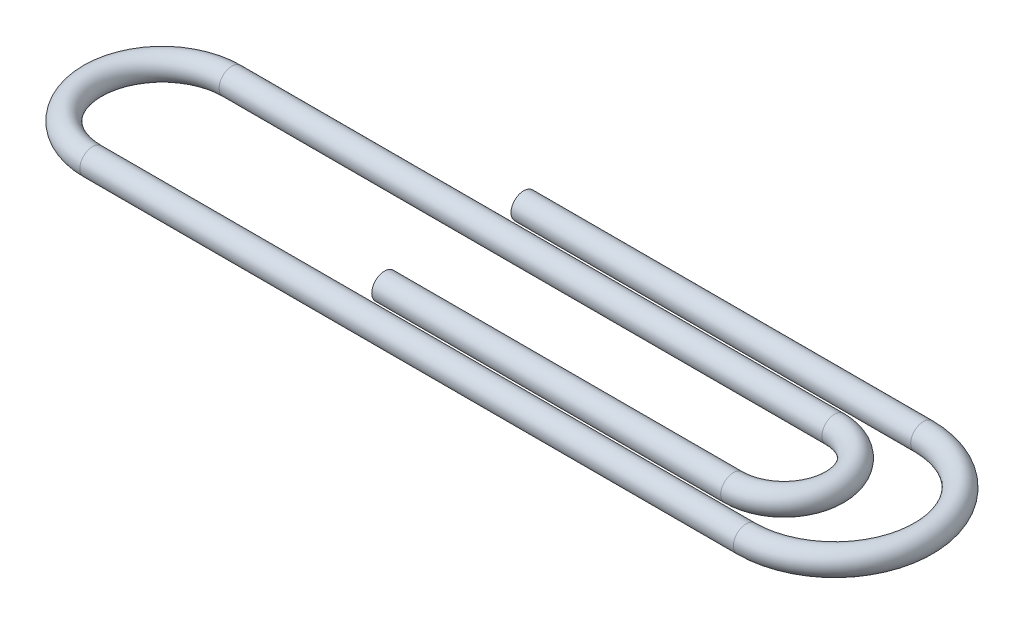
ISO-10303-21;
HEADER;
FILE_DESCRIPTION(('STEP AP214'),'2;1');
FILE_NAME('part.step','',(''),(''),'','','');
FILE_SCHEMA(('AUTOMOTIVE_DESIGN { 1 0 10303 214 1 1 1 1 }'));
ENDSEC;
DATA;
#1=APPLICATION_CONTEXT('core data for automotive mechanical design processes');
#2=APPLICATION_PROTOCOL_DEFINITION('international standard','automotive_design',2000,#1);
#3=PRODUCT_CONTEXT('',#1,'mechanical');
#4=PRODUCT('Part','Part','',(#3));
#5=PRODUCT_RELATED_PRODUCT_CATEGORY('part','',(#4));
#6=PRODUCT_DEFINITION_FORMATION('','',#4);
#7=PRODUCT_DEFINITION_CONTEXT('part definition',#1,'design');
#8=PRODUCT_DEFINITION('design','',#6,#7);
#9=PRODUCT_DEFINITION_SHAPE('','',#8);
#10=(LENGTH_UNIT() NAMED_UNIT(*) SI_UNIT(.MILLI.,.METRE.));
#11=(NAMED_UNIT(*) PLANE_ANGLE_UNIT() SI_UNIT($,.RADIAN.));
#12=(NAMED_UNIT(*) SI_UNIT($,.STERADIAN.) SOLID_ANGLE_UNIT());
#13=UNCERTAINTY_MEASURE_WITH_UNIT(LENGTH_MEASURE(1.E-05),#10,'distance_accuracy_value','');
#14=(GEOMETRIC_REPRESENTATION_CONTEXT(3) GLOBAL_UNCERTAINTY_ASSIGNED_CONTEXT((#13)) GLOBAL_UNIT_ASSIGNED_CONTEXT((#10,
#11,#12)) REPRESENTATION_CONTEXT('',''));
#15=CARTESIAN_POINT('',(0.,0.,0.));
#16=DIRECTION('',(0.,0.,1.));
#17=DIRECTION('',(1.,0.,0.));
#18=AXIS2_PLACEMENT_3D('',#15,#16,#17);
#19=CARTESIAN_POINT('',(10.,0.,-4.24338213801302));
#20=DIRECTION('',(1.,0.,0.));
#21=DIRECTION('',(0.,0.,-1.));
#22=AXIS2_PLACEMENT_3D('',#19,#20,#21);
#23=PLANE('',#22);
#24=CARTESIAN_POINT('',(10.,0.,-4.24338213801302));
#25=DIRECTION('',(1.,0.,0.));
#26=DIRECTION('',(0.,0.,-1.));
#27=AXIS2_PLACEMENT_3D('',#24,#25,#26);
#28=CIRCLE('',#27,0.5);
#29=CARTESIAN_POINT('',(10.,0.,-4.74338213801302));
#30=VERTEX_POINT('',#29);
#31=EDGE_CURVE('E76',#30,#30,#28,.T.);
#32=ORIENTED_EDGE('',*,*,#31,.F.);
#33=EDGE_LOOP('',(#32));
#34=FACE_BOUND('',#33,.T.);
#35=ADVANCED_FACE('F41',(#34),#23,.F.);
#36=CARTESIAN_POINT('',(10.,0.,1.24338213801301));
#37=DIRECTION('',(-1.,0.,0.));
#38=DIRECTION('',(0.,0.,1.));
#39=AXIS2_PLACEMENT_3D('',#36,#37,#38);
#40=PLANE('',#39);
#41=CARTESIAN_POINT('',(10.,0.,1.24338213801301));
#42=DIRECTION('',(-1.,0.,0.));
#43=DIRECTION('',(0.,0.,1.));
#44=AXIS2_PLACEMENT_3D('',#41,#42,#43);
#45=CIRCLE('',#44,0.5);
#46=CARTESIAN_POINT('',(10.,0.,1.74338213801301));
#47=VERTEX_POINT('',#46);
#48=EDGE_CURVE('E10',#47,#47,#45,.T.);
#49=ORIENTED_EDGE('',*,*,#48,.T.);
#50=EDGE_LOOP('',(#49));
#51=FACE_BOUND('',#50,.T.);
#52=ADVANCED_FACE('F84',(#51),#40,.T.);
#53=CARTESIAN_POINT('',(10.,0.,-4.24338213801302));
#54=DIRECTION('',(1.,0.,0.));
#55=DIRECTION('',(0.,0.,-1.));
#56=AXIS2_PLACEMENT_3D('',#53,#54,#55);
#57=CYLINDRICAL_SURFACE('',#56,0.5);
#58=CARTESIAN_POINT('',(25.75,0.,-4.24338213801302));
#59=DIRECTION('',(1.,0.,0.));
#60=DIRECTION('',(0.,0.,-1.));
#61=AXIS2_PLACEMENT_3D('',#58,#59,#60);
#62=CIRCLE('',#61,0.5);
#63=CARTESIAN_POINT('',(25.75,0.,-4.74338213801302));
#64=VERTEX_POINT('',#63);
#65=EDGE_CURVE('E72',#64,#64,#62,.T.);
#66=ORIENTED_EDGE('',*,*,#65,.F.);
#67=EDGE_LOOP('',(#66));
#68=FACE_BOUND('',#67,.T.);
#69=ORIENTED_EDGE('',*,*,#31,.T.);
#70=EDGE_LOOP('',(#69));
#71=FACE_BOUND('',#70,.T.);
#72=ADVANCED_FACE('F81',(#68,#71),#57,.T.);
#73=CARTESIAN_POINT('',(25.75,0.,-0.750000000000001));
#74=DIRECTION('',(0.,-1.,0.));
#75=DIRECTION('',(0.,0.,-1.));
#76=AXIS2_PLACEMENT_3D('',#73,#74,#75);
#77=TOROIDAL_SURFACE('',#76,3.49338213801302,0.5);
#78=CARTESIAN_POINT('',(25.75,0.,2.74338213801302));
#79=DIRECTION('',(-1.,0.,0.));
#80=DIRECTION('',(0.,0.,1.));
#81=AXIS2_PLACEMENT_3D('',#78,#79,#80);
#82=CIRCLE('',#81,0.5);
#83=CARTESIAN_POINT('',(25.75,0.,3.24338213801301));
#84=VERTEX_POINT('',#83);
#85=EDGE_CURVE('E68',#84,#84,#82,.T.);
#86=CARTESIAN_POINT('',(25.75,0.,-0.750000000000001));
#87=DIRECTION('',(0.,-1.,0.));
#88=DIRECTION('',(0.,0.,-1.));
#89=AXIS2_PLACEMENT_3D('',#86,#87,#88);
#90=CIRCLE('',#89,3.99338213801302);
#91=EDGE_CURVE('',#64,#84,#90,.T.);
#92=ORIENTED_EDGE('',*,*,#65,.T.);
#93=ORIENTED_EDGE('',*,*,#85,.F.);
#94=ORIENTED_EDGE('',*,*,#91,.T.);
#95=ORIENTED_EDGE('',*,*,#91,.F.);
#96=EDGE_LOOP('',(#92,#94,#93,#95));
#97=FACE_BOUND('',#96,.T.);
#98=ADVANCED_FACE('F110',(#97),#77,.T.);
#99=CARTESIAN_POINT('',(25.75,0.,2.74338213801301));
#100=DIRECTION('',(-1.,0.,0.));
#101=DIRECTION('',(0.,0.,1.));
#102=AXIS2_PLACEMENT_3D('',#99,#100,#101);
#103=CYLINDRICAL_SURFACE('',#102,0.5);
#104=CARTESIAN_POINT('',(0.,0.,2.74338213801301));
#105=DIRECTION('',(-1.,0.,0.));
#106=DIRECTION('',(0.,0.,1.));
#107=AXIS2_PLACEMENT_3D('',#104,#105,#106);
#108=CIRCLE('',#107,0.5);
#109=CARTESIAN_POINT('',(0.,0.,3.24338213801302));
#110=VERTEX_POINT('',#109);
#111=EDGE_CURVE('E64',#110,#110,#108,.T.);
#112=ORIENTED_EDGE('',*,*,#111,.F.);
#113=EDGE_LOOP('',(#112));
#114=FACE_BOUND('',#113,.T.);
#115=ORIENTED_EDGE('',*,*,#85,.T.);
#116=EDGE_LOOP('',(#115));
#117=FACE_BOUND('',#116,.T.);
#118=ADVANCED_FACE('F106',(#114,#117),#103,.T.);
#119=CARTESIAN_POINT('',(0.,0.,0.));
#120=DIRECTION('',(0.,-1.,0.));
#121=DIRECTION('',(0.,0.,-1.));
#122=AXIS2_PLACEMENT_3D('',#119,#120,#121);
#123=TOROIDAL_SURFACE('',#122,2.74338213801302,0.5);
#124=CARTESIAN_POINT('',(0.,0.,-2.74338213801301));
#125=DIRECTION('',(1.,0.,0.));
#126=DIRECTION('',(0.,0.,-1.));
#127=AXIS2_PLACEMENT_3D('',#124,#125,#126);
#128=CIRCLE('',#127,0.5);
#129=CARTESIAN_POINT('',(0.,0.,-3.24338213801302));
#130=VERTEX_POINT('',#129);
#131=EDGE_CURVE('E58',#130,#130,#128,.T.);
#132=CARTESIAN_POINT('',(0.,0.,0.));
#133=DIRECTION('',(0.,-1.,0.));
#134=DIRECTION('',(0.,0.,-1.));
#135=AXIS2_PLACEMENT_3D('',#132,#133,#134);
#136=CIRCLE('',#135,3.24338213801302);
#137=EDGE_CURVE('',#110,#130,#136,.T.);
#138=ORIENTED_EDGE('',*,*,#111,.T.);
#139=ORIENTED_EDGE('',*,*,#131,.F.);
#140=ORIENTED_EDGE('',*,*,#137,.T.);
#141=ORIENTED_EDGE('',*,*,#137,.F.);
#142=EDGE_LOOP('',(#138,#140,#139,#141));
#143=FACE_BOUND('',#142,.T.);
#144=ADVANCED_FACE('F102',(#143),#123,.T.);
#145=CARTESIAN_POINT('',(0.,0.,-2.74338213801302));
#146=DIRECTION('',(1.,0.,0.));
#147=DIRECTION('',(0.,0.,-1.));
#148=AXIS2_PLACEMENT_3D('',#145,#146,#147);
#149=CYLINDRICAL_SURFACE('',#148,0.5);
#150=CARTESIAN_POINT('',(23.75,0.,-2.74338213801302));
#151=DIRECTION('',(1.,0.,0.));
#152=DIRECTION('',(0.,0.,-1.));
#153=AXIS2_PLACEMENT_3D('',#150,#151,#152);
#154=CIRCLE('',#153,0.5);
#155=CARTESIAN_POINT('',(23.75,0.,-3.243382138013));
#156=VERTEX_POINT('',#155);
#157=EDGE_CURVE('E53',#156,#156,#154,.T.);
#158=ORIENTED_EDGE('',*,*,#157,.F.);
#159=EDGE_LOOP('',(#158));
#160=FACE_BOUND('',#159,.T.);
#161=ORIENTED_EDGE('',*,*,#131,.T.);
#162=EDGE_LOOP('',(#161));
#163=FACE_BOUND('',#162,.T.);
#164=ADVANCED_FACE('F96',(#160,#163),#149,.T.);
#165=CARTESIAN_POINT('',(23.75,0.,-0.750000000000001));
#166=DIRECTION('',(0.,-1.,0.));
#167=DIRECTION('',(0.,0.,-1.));
#168=AXIS2_PLACEMENT_3D('',#165,#166,#167);
#169=TOROIDAL_SURFACE('',#168,1.993382138013,0.5);
#170=CARTESIAN_POINT('',(23.75,0.,1.24338213801301));
#171=DIRECTION('',(-1.,0.,0.));
#172=DIRECTION('',(0.,0.,1.));
#173=AXIS2_PLACEMENT_3D('',#170,#171,#172);
#174=CIRCLE('',#173,0.5);
#175=CARTESIAN_POINT('',(23.75,0.,1.743382138013));
#176=VERTEX_POINT('',#175);
#177=EDGE_CURVE('E48',#176,#176,#174,.T.);
#178=CARTESIAN_POINT('',(23.75,0.,-0.750000000000001));
#179=DIRECTION('',(0.,-1.,0.));
#180=DIRECTION('',(0.,0.,-1.));
#181=AXIS2_PLACEMENT_3D('',#178,#179,#180);
#182=CIRCLE('',#181,2.493382138013);
#183=EDGE_CURVE('',#156,#176,#182,.T.);
#184=ORIENTED_EDGE('',*,*,#157,.T.);
#185=ORIENTED_EDGE('',*,*,#177,.F.);
#186=ORIENTED_EDGE('',*,*,#183,.T.);
#187=ORIENTED_EDGE('',*,*,#183,.F.);
#188=EDGE_LOOP('',(#184,#186,#185,#187));
#189=FACE_BOUND('',#188,.T.);
#190=ADVANCED_FACE('F90',(#189),#169,.T.);
#191=CARTESIAN_POINT('',(23.75,0.,1.24338213801301));
#192=DIRECTION('',(-1.,0.,0.));
#193=DIRECTION('',(0.,0.,1.));
#194=AXIS2_PLACEMENT_3D('',#191,#192,#193);
#195=CYLINDRICAL_SURFACE('',#194,0.5);
#196=ORIENTED_EDGE('',*,*,#48,.F.);
#197=EDGE_LOOP('',(#196));
#198=FACE_BOUND('',#197,.T.);
#199=ORIENTED_EDGE('',*,*,#177,.T.);
#200=EDGE_LOOP('',(#199));
#201=FACE_BOUND('',#200,.T.);
#202=ADVANCED_FACE('F88',(#198,#201),#195,.T.);
#203=CLOSED_SHELL('',(#35,#52,#72,#98,#118,#144,#164,#190,#202));
#204=MANIFOLD_SOLID_BREP('B2',#203);
#205=ADVANCED_BREP_SHAPE_REPRESENTATION('',(#18,#204),#14);
#206=SHAPE_DEFINITION_REPRESENTATION(#9,#205);
ENDSEC;
END-ISO-10303-21;
